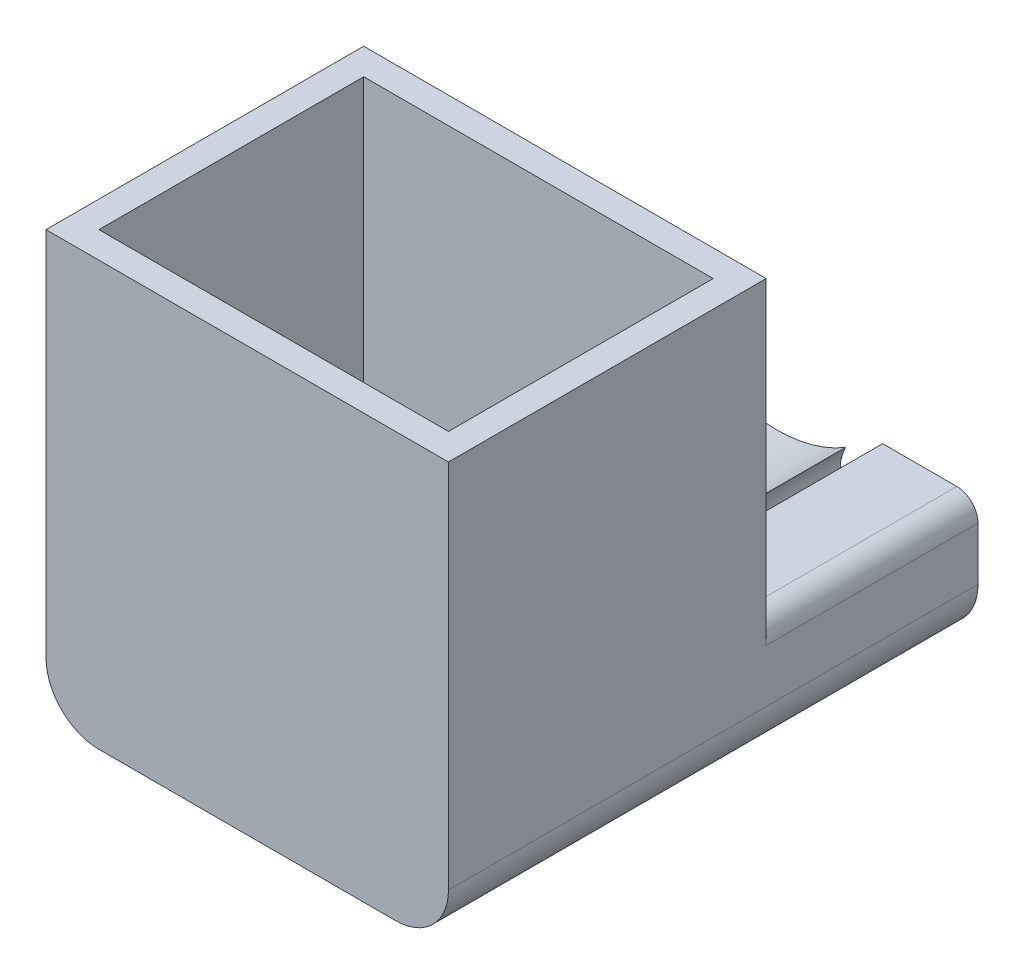
ISO-10303-21;
HEADER;
FILE_DESCRIPTION(('STEP AP214'),'2;1');
FILE_NAME('part.step','',(''),(''),'','','');
FILE_SCHEMA(('AUTOMOTIVE_DESIGN { 1 0 10303 214 1 1 1 1 }'));
ENDSEC;
DATA;
#1=APPLICATION_CONTEXT('core data for automotive mechanical design processes');
#2=APPLICATION_PROTOCOL_DEFINITION('international standard','automotive_design',2000,#1);
#3=PRODUCT_CONTEXT('',#1,'mechanical');
#4=PRODUCT('Part','Part','',(#3));
#5=PRODUCT_RELATED_PRODUCT_CATEGORY('part','',(#4));
#6=PRODUCT_DEFINITION_FORMATION('','',#4);
#7=PRODUCT_DEFINITION_CONTEXT('part definition',#1,'design');
#8=PRODUCT_DEFINITION('design','',#6,#7);
#9=PRODUCT_DEFINITION_SHAPE('','',#8);
#10=(LENGTH_UNIT() NAMED_UNIT(*) SI_UNIT(.MILLI.,.METRE.));
#11=(NAMED_UNIT(*) PLANE_ANGLE_UNIT() SI_UNIT($,.RADIAN.));
#12=(NAMED_UNIT(*) SI_UNIT($,.STERADIAN.) SOLID_ANGLE_UNIT());
#13=UNCERTAINTY_MEASURE_WITH_UNIT(LENGTH_MEASURE(1.E-05),#10,'distance_accuracy_value','');
#14=(GEOMETRIC_REPRESENTATION_CONTEXT(3) GLOBAL_UNCERTAINTY_ASSIGNED_CONTEXT((#13)) GLOBAL_UNIT_ASSIGNED_CONTEXT((#10,
#11,#12)) REPRESENTATION_CONTEXT('',''));
#15=CARTESIAN_POINT('',(0.,0.,0.));
#16=DIRECTION('',(0.,0.,1.));
#17=DIRECTION('',(1.,0.,0.));
#18=AXIS2_PLACEMENT_3D('',#15,#16,#17);
#19=CARTESIAN_POINT('',(-9.99999999999999,-13.1244047484067,10.));
#20=DIRECTION('',(0.,0.,-1.));
#21=DIRECTION('',(-1.,0.,0.));
#22=AXIS2_PLACEMENT_3D('',#19,#20,#21);
#23=CYLINDRICAL_SURFACE('',#22,4.);
#24=CARTESIAN_POINT('',(-9.99999999999999,-13.1244047484067,-10.));
#25=DIRECTION('',(0.,0.,-1.));
#26=DIRECTION('',(-1.,0.,0.));
#27=AXIS2_PLACEMENT_3D('',#24,#25,#26);
#28=CIRCLE('',#27,4.);
#29=CARTESIAN_POINT('',(-6.50911973324602,-11.1715209927295,-10.));
#30=VERTEX_POINT('',#29);
#31=CARTESIAN_POINT('',(-9.99999999999999,-9.12440474840669,-10.));
#32=VERTEX_POINT('',#31);
#33=EDGE_CURVE('E219',#30,#32,#28,.T.);
#34=ORIENTED_EDGE('',*,*,#33,.T.);
#35=DIRECTION('',(0.,0.,-1.));
#36=VECTOR('',#35,1.);
#37=CARTESIAN_POINT('',(-9.99999999999999,-9.12440474840669,10.));
#38=LINE('',#37,#36);
#39=CARTESIAN_POINT('',(-9.99999999999999,-9.12440474840669,10.));
#40=VERTEX_POINT('',#39);
#41=EDGE_CURVE('E262',#40,#32,#38,.T.);
#42=ORIENTED_EDGE('',*,*,#41,.F.);
#43=CARTESIAN_POINT('',(-9.99999999999999,-13.1244047484067,10.));
#44=DIRECTION('',(0.,0.,-1.));
#45=DIRECTION('',(-1.,0.,0.));
#46=AXIS2_PLACEMENT_3D('',#43,#44,#45);
#47=CIRCLE('',#46,4.);
#48=CARTESIAN_POINT('',(-6.50911973324602,-11.1715209927295,10.));
#49=VERTEX_POINT('',#48);
#50=EDGE_CURVE('E220',#49,#40,#47,.T.);
#51=ORIENTED_EDGE('',*,*,#50,.F.);
#52=DIRECTION('',(0.,0.,-1.));
#53=VECTOR('',#52,1.);
#54=CARTESIAN_POINT('',(-6.50911973324602,-11.1715209927295,10.));
#55=LINE('',#54,#53);
#56=EDGE_CURVE('E235',#49,#30,#55,.T.);
#57=ORIENTED_EDGE('',*,*,#56,.T.);
#58=EDGE_LOOP('',(#34,#42,#51,#57));
#59=FACE_BOUND('',#58,.T.);
#60=ADVANCED_FACE('F36',(#59),#23,.F.);
#61=CARTESIAN_POINT('',(-9.99999999999999,-9.12440474840669,10.));
#62=DIRECTION('',(0.,-1.,0.));
#63=DIRECTION('',(1.,0.,0.));
#64=AXIS2_PLACEMENT_3D('',#61,#62,#63);
#65=PLANE('',#64);
#66=DIRECTION('',(-1.,0.,0.));
#67=VECTOR('',#66,1.);
#68=CARTESIAN_POINT('',(-9.99999999999999,-9.12440474840669,-10.));
#69=LINE('',#68,#67);
#70=CARTESIAN_POINT('',(-17.,-9.12440474840669,-10.));
#71=VERTEX_POINT('',#70);
#72=EDGE_CURVE('E238',#32,#71,#69,.T.);
#73=ORIENTED_EDGE('',*,*,#72,.T.);
#74=DIRECTION('',(0.,0.,-1.));
#75=VECTOR('',#74,1.);
#76=CARTESIAN_POINT('',(-17.,-9.12440474840669,10.));
#77=LINE('',#76,#75);
#78=CARTESIAN_POINT('',(-17.,-9.12440474840669,10.));
#79=VERTEX_POINT('',#78);
#80=EDGE_CURVE('E291',#71,#79,#77,.F.);
#81=ORIENTED_EDGE('',*,*,#80,.T.);
#82=DIRECTION('',(-1.,0.,0.));
#83=VECTOR('',#82,1.);
#84=CARTESIAN_POINT('',(-9.99999999999999,-9.12440474840669,10.));
#85=LINE('',#84,#83);
#86=EDGE_CURVE('E223',#40,#79,#85,.T.);
#87=ORIENTED_EDGE('',*,*,#86,.F.);
#88=ORIENTED_EDGE('',*,*,#41,.T.);
#89=EDGE_LOOP('',(#73,#81,#87,#88));
#90=FACE_BOUND('',#89,.T.);
#91=ADVANCED_FACE('F352',(#90),#65,.F.);
#92=CARTESIAN_POINT('',(-19.,-9.12440474840669,10.));
#93=DIRECTION('',(1.,0.,0.));
#94=DIRECTION('',(0.,0.,-1.));
#95=AXIS2_PLACEMENT_3D('',#92,#93,#94);
#96=PLANE('',#95);
#97=DIRECTION('',(0.,-1.,0.));
#98=VECTOR('',#97,1.);
#99=CARTESIAN_POINT('',(-19.,-21.1244047484067,10.));
#100=LINE('',#99,#98);
#101=CARTESIAN_POINT('',(-19.,18.8755952515933,10.));
#102=VERTEX_POINT('',#101);
#103=CARTESIAN_POINT('',(-19.,-11.1244047484067,10.));
#104=VERTEX_POINT('',#103);
#105=EDGE_CURVE('E202',#102,#104,#100,.T.);
#106=ORIENTED_EDGE('',*,*,#105,.T.);
#107=DIRECTION('',(0.,0.,-1.));
#108=VECTOR('',#107,1.);
#109=CARTESIAN_POINT('',(-19.,-11.1244047484067,10.));
#110=LINE('',#109,#108);
#111=CARTESIAN_POINT('',(-19.,-11.1244047484067,-10.));
#112=VERTEX_POINT('',#111);
#113=EDGE_CURVE('E284',#104,#112,#110,.T.);
#114=ORIENTED_EDGE('',*,*,#113,.T.);
#115=DIRECTION('',(0.,-1.,0.));
#116=VECTOR('',#115,1.);
#117=CARTESIAN_POINT('',(-19.,-9.12440474840669,-10.));
#118=LINE('',#117,#116);
#119=CARTESIAN_POINT('',(-19.,-16.1244047484067,-10.));
#120=VERTEX_POINT('',#119);
#121=EDGE_CURVE('E241',#112,#120,#118,.T.);
#122=ORIENTED_EDGE('',*,*,#121,.T.);
#123=DIRECTION('',(0.,0.,-1.));
#124=VECTOR('',#123,1.);
#125=CARTESIAN_POINT('',(-19.,-16.1244047484067,10.));
#126=LINE('',#125,#124);
#127=CARTESIAN_POINT('',(-19.,-16.1244047484067,40.));
#128=VERTEX_POINT('',#127);
#129=EDGE_CURVE('E275',#120,#128,#126,.F.);
#130=ORIENTED_EDGE('',*,*,#129,.T.);
#131=DIRECTION('',(0.,-1.,0.));
#132=VECTOR('',#131,1.);
#133=CARTESIAN_POINT('',(-19.,-21.1244047484067,40.));
#134=LINE('',#133,#132);
#135=CARTESIAN_POINT('',(-19.,18.8755952515933,40.));
#136=VERTEX_POINT('',#135);
#137=EDGE_CURVE('E206',#136,#128,#134,.T.);
#138=ORIENTED_EDGE('',*,*,#137,.F.);
#139=DIRECTION('',(0.,0.,-1.));
#140=VECTOR('',#139,1.);
#141=CARTESIAN_POINT('',(-19.,18.8755952515933,40.));
#142=LINE('',#141,#140);
#143=EDGE_CURVE('E209',#136,#102,#142,.T.);
#144=ORIENTED_EDGE('',*,*,#143,.T.);
#145=EDGE_LOOP('',(#106,#114,#122,#130,#138,#144));
#146=FACE_BOUND('',#145,.T.);
#147=ADVANCED_FACE('F307',(#146),#96,.F.);
#148=CARTESIAN_POINT('',(-19.,-21.1244047484067,10.));
#149=DIRECTION('',(0.,1.,0.));
#150=DIRECTION('',(0.,0.,1.));
#151=AXIS2_PLACEMENT_3D('',#148,#149,#150);
#152=PLANE('',#151);
#153=DIRECTION('',(1.,0.,0.));
#154=VECTOR('',#153,1.);
#155=CARTESIAN_POINT('',(-19.,-21.1244047484067,40.));
#156=LINE('',#155,#154);
#157=CARTESIAN_POINT('',(-14.,-21.1244047484067,40.));
#158=VERTEX_POINT('',#157);
#159=CARTESIAN_POINT('',(14.,-21.1244047484067,40.));
#160=VERTEX_POINT('',#159);
#161=EDGE_CURVE('E198',#158,#160,#156,.T.);
#162=ORIENTED_EDGE('',*,*,#161,.F.);
#163=DIRECTION('',(0.,0.,-1.));
#164=VECTOR('',#163,1.);
#165=CARTESIAN_POINT('',(-14.,-21.1244047484067,10.));
#166=LINE('',#165,#164);
#167=CARTESIAN_POINT('',(-14.,-21.1244047484067,-10.));
#168=VERTEX_POINT('',#167);
#169=EDGE_CURVE('E267',#158,#168,#166,.T.);
#170=ORIENTED_EDGE('',*,*,#169,.T.);
#171=DIRECTION('',(1.,0.,0.));
#172=VECTOR('',#171,1.);
#173=CARTESIAN_POINT('',(-19.,-21.1244047484067,-10.));
#174=LINE('',#173,#172);
#175=CARTESIAN_POINT('',(14.,-21.1244047484067,-10.));
#176=VERTEX_POINT('',#175);
#177=EDGE_CURVE('E243',#168,#176,#174,.T.);
#178=ORIENTED_EDGE('',*,*,#177,.T.);
#179=DIRECTION('',(0.,0.,-1.));
#180=VECTOR('',#179,1.);
#181=CARTESIAN_POINT('',(14.,-21.1244047484067,10.));
#182=LINE('',#181,#180);
#183=EDGE_CURVE('E265',#176,#160,#182,.F.);
#184=ORIENTED_EDGE('',*,*,#183,.T.);
#185=EDGE_LOOP('',(#162,#170,#178,#184));
#186=FACE_BOUND('',#185,.T.);
#187=ADVANCED_FACE('F359',(#186),#152,.F.);
#188=CARTESIAN_POINT('',(19.,-21.1244047484067,10.));
#189=DIRECTION('',(-1.,0.,0.));
#190=DIRECTION('',(0.,0.,1.));
#191=AXIS2_PLACEMENT_3D('',#188,#189,#190);
#192=PLANE('',#191);
#193=DIRECTION('',(0.,1.,0.));
#194=VECTOR('',#193,1.);
#195=CARTESIAN_POINT('',(19.,-21.1244047484067,-10.));
#196=LINE('',#195,#194);
#197=CARTESIAN_POINT('',(19.,-16.1244047484067,-10.));
#198=VERTEX_POINT('',#197);
#199=CARTESIAN_POINT('',(19.,-11.1244047484067,-10.));
#200=VERTEX_POINT('',#199);
#201=EDGE_CURVE('E246',#198,#200,#196,.T.);
#202=ORIENTED_EDGE('',*,*,#201,.T.);
#203=DIRECTION('',(0.,0.,-1.));
#204=VECTOR('',#203,1.);
#205=CARTESIAN_POINT('',(19.,-11.1244047484067,10.));
#206=LINE('',#205,#204);
#207=CARTESIAN_POINT('',(19.,-11.1244047484067,10.));
#208=VERTEX_POINT('',#207);
#209=EDGE_CURVE('E296',#200,#208,#206,.F.);
#210=ORIENTED_EDGE('',*,*,#209,.T.);
#211=DIRECTION('',(0.,1.,0.));
#212=VECTOR('',#211,1.);
#213=CARTESIAN_POINT('',(19.,-21.1244047484067,10.));
#214=LINE('',#213,#212);
#215=CARTESIAN_POINT('',(19.,18.8755952515933,10.));
#216=VERTEX_POINT('',#215);
#217=EDGE_CURVE('E58',#208,#216,#214,.T.);
#218=ORIENTED_EDGE('',*,*,#217,.T.);
#219=DIRECTION('',(0.,0.,-1.));
#220=VECTOR('',#219,1.);
#221=CARTESIAN_POINT('',(19.,18.8755952515933,40.));
#222=LINE('',#221,#220);
#223=CARTESIAN_POINT('',(19.,18.8755952515933,40.));
#224=VERTEX_POINT('',#223);
#225=EDGE_CURVE('E216',#224,#216,#222,.T.);
#226=ORIENTED_EDGE('',*,*,#225,.F.);
#227=DIRECTION('',(0.,1.,0.));
#228=VECTOR('',#227,1.);
#229=CARTESIAN_POINT('',(19.,-21.1244047484067,40.));
#230=LINE('',#229,#228);
#231=CARTESIAN_POINT('',(19.,-16.1244047484067,40.));
#232=VERTEX_POINT('',#231);
#233=EDGE_CURVE('E201',#232,#224,#230,.T.);
#234=ORIENTED_EDGE('',*,*,#233,.F.);
#235=DIRECTION('',(0.,0.,-1.));
#236=VECTOR('',#235,1.);
#237=CARTESIAN_POINT('',(19.,-16.1244047484067,10.));
#238=LINE('',#237,#236);
#239=EDGE_CURVE('E281',#232,#198,#238,.T.);
#240=ORIENTED_EDGE('',*,*,#239,.T.);
#241=EDGE_LOOP('',(#202,#210,#218,#226,#234,#240));
#242=FACE_BOUND('',#241,.T.);
#243=ADVANCED_FACE('F327',(#242),#192,.F.);
#244=CARTESIAN_POINT('',(19.,-9.12440474840668,10.));
#245=DIRECTION('',(0.,-1.,0.));
#246=DIRECTION('',(0.,0.,-1.));
#247=AXIS2_PLACEMENT_3D('',#244,#245,#246);
#248=PLANE('',#247);
#249=DIRECTION('',(-1.,0.,0.));
#250=VECTOR('',#249,1.);
#251=CARTESIAN_POINT('',(19.,-9.12440474840668,10.));
#252=LINE('',#251,#250);
#253=CARTESIAN_POINT('',(17.,-9.12440474840668,10.));
#254=VERTEX_POINT('',#253);
#255=CARTESIAN_POINT('',(10.,-9.12440474840668,10.));
#256=VERTEX_POINT('',#255);
#257=EDGE_CURVE('E227',#254,#256,#252,.T.);
#258=ORIENTED_EDGE('',*,*,#257,.F.);
#259=DIRECTION('',(0.,0.,-1.));
#260=VECTOR('',#259,1.);
#261=CARTESIAN_POINT('',(17.,-9.12440474840668,10.));
#262=LINE('',#261,#260);
#263=CARTESIAN_POINT('',(17.,-9.12440474840668,-10.));
#264=VERTEX_POINT('',#263);
#265=EDGE_CURVE('E293',#254,#264,#262,.T.);
#266=ORIENTED_EDGE('',*,*,#265,.T.);
#267=DIRECTION('',(-1.,0.,0.));
#268=VECTOR('',#267,1.);
#269=CARTESIAN_POINT('',(19.,-9.12440474840668,-10.));
#270=LINE('',#269,#268);
#271=CARTESIAN_POINT('',(10.,-9.12440474840668,-10.));
#272=VERTEX_POINT('',#271);
#273=EDGE_CURVE('E249',#264,#272,#270,.T.);
#274=ORIENTED_EDGE('',*,*,#273,.T.);
#275=DIRECTION('',(0.,0.,-1.));
#276=VECTOR('',#275,1.);
#277=CARTESIAN_POINT('',(10.,-9.12440474840668,10.));
#278=LINE('',#277,#276);
#279=EDGE_CURVE('E259',#256,#272,#278,.T.);
#280=ORIENTED_EDGE('',*,*,#279,.F.);
#281=EDGE_LOOP('',(#258,#266,#274,#280));
#282=FACE_BOUND('',#281,.T.);
#283=ADVANCED_FACE('F337',(#282),#248,.F.);
#284=CARTESIAN_POINT('',(10.,-13.1244047484067,10.));
#285=DIRECTION('',(0.,0.,-1.));
#286=DIRECTION('',(-1.,0.,0.));
#287=AXIS2_PLACEMENT_3D('',#284,#285,#286);
#288=CYLINDRICAL_SURFACE('',#287,4.);
#289=CARTESIAN_POINT('',(10.,-13.1244047484067,-10.));
#290=DIRECTION('',(0.,0.,-1.));
#291=DIRECTION('',(1.,0.,0.));
#292=AXIS2_PLACEMENT_3D('',#289,#290,#291);
#293=CIRCLE('',#292,4.);
#294=CARTESIAN_POINT('',(6.50911973324603,-11.1715209927295,-10.));
#295=VERTEX_POINT('',#294);
#296=EDGE_CURVE('E251',#272,#295,#293,.T.);
#297=ORIENTED_EDGE('',*,*,#296,.T.);
#298=DIRECTION('',(0.,0.,-1.));
#299=VECTOR('',#298,1.);
#300=CARTESIAN_POINT('',(6.50911973324603,-11.1715209927295,10.));
#301=LINE('',#300,#299);
#302=CARTESIAN_POINT('',(6.50911973324603,-11.1715209927295,10.));
#303=VERTEX_POINT('',#302);
#304=EDGE_CURVE('E256',#303,#295,#301,.T.);
#305=ORIENTED_EDGE('',*,*,#304,.F.);
#306=CARTESIAN_POINT('',(10.,-13.1244047484067,10.));
#307=DIRECTION('',(0.,0.,-1.));
#308=DIRECTION('',(1.,0.,0.));
#309=AXIS2_PLACEMENT_3D('',#306,#307,#308);
#310=CIRCLE('',#309,4.);
#311=EDGE_CURVE('E229',#256,#303,#310,.T.);
#312=ORIENTED_EDGE('',*,*,#311,.F.);
#313=ORIENTED_EDGE('',*,*,#279,.T.);
#314=EDGE_LOOP('',(#297,#305,#312,#313));
#315=FACE_BOUND('',#314,.T.);
#316=ADVANCED_FACE('F342',(#315),#288,.F.);
#317=CARTESIAN_POINT('',(0.,-0.5,10.));
#318=DIRECTION('',(0.,0.,-1.));
#319=DIRECTION('',(-1.,0.,0.));
#320=AXIS2_PLACEMENT_3D('',#317,#318,#319);
#321=CYLINDRICAL_SURFACE('',#320,12.5);
#322=CARTESIAN_POINT('',(0.,-0.5,-10.));
#323=DIRECTION('',(0.,0.,-1.));
#324=DIRECTION('',(1.,0.,0.));
#325=AXIS2_PLACEMENT_3D('',#322,#323,#324);
#326=CIRCLE('',#325,12.5);
#327=EDGE_CURVE('E224',#295,#30,#326,.T.);
#328=ORIENTED_EDGE('',*,*,#327,.T.);
#329=ORIENTED_EDGE('',*,*,#56,.F.);
#330=CARTESIAN_POINT('',(0.,-0.5,10.));
#331=DIRECTION('',(0.,0.,-1.));
#332=DIRECTION('',(1.,0.,0.));
#333=AXIS2_PLACEMENT_3D('',#330,#331,#332);
#334=CIRCLE('',#333,12.5);
#335=EDGE_CURVE('E232',#303,#49,#334,.T.);
#336=ORIENTED_EDGE('',*,*,#335,.F.);
#337=ORIENTED_EDGE('',*,*,#304,.T.);
#338=EDGE_LOOP('',(#328,#329,#336,#337));
#339=FACE_BOUND('',#338,.T.);
#340=ADVANCED_FACE('F346',(#339),#321,.F.);
#341=CARTESIAN_POINT('',(-9.99999999999999,-13.1244047484067,-10.));
#342=DIRECTION('',(0.,0.,-1.));
#343=DIRECTION('',(-1.,0.,0.));
#344=AXIS2_PLACEMENT_3D('',#341,#342,#343);
#345=PLANE('',#344);
#346=ORIENTED_EDGE('',*,*,#121,.F.);
#347=CARTESIAN_POINT('',(-17.,-11.1244047484067,-10.));
#348=DIRECTION('',(0.,0.,-1.));
#349=DIRECTION('',(-1.,0.,0.));
#350=AXIS2_PLACEMENT_3D('',#347,#348,#349);
#351=CIRCLE('',#350,2.);
#352=EDGE_CURVE('E289',#112,#71,#351,.T.);
#353=ORIENTED_EDGE('',*,*,#352,.T.);
#354=ORIENTED_EDGE('',*,*,#72,.F.);
#355=ORIENTED_EDGE('',*,*,#33,.F.);
#356=ORIENTED_EDGE('',*,*,#327,.F.);
#357=ORIENTED_EDGE('',*,*,#296,.F.);
#358=ORIENTED_EDGE('',*,*,#273,.F.);
#359=CARTESIAN_POINT('',(17.,-11.1244047484067,-10.));
#360=DIRECTION('',(0.,0.,-1.));
#361=DIRECTION('',(-1.,0.,0.));
#362=AXIS2_PLACEMENT_3D('',#359,#360,#361);
#363=CIRCLE('',#362,2.);
#364=EDGE_CURVE('E287',#264,#200,#363,.T.);
#365=ORIENTED_EDGE('',*,*,#364,.T.);
#366=ORIENTED_EDGE('',*,*,#201,.F.);
#367=CARTESIAN_POINT('',(14.,-16.1244047484067,-10.));
#368=DIRECTION('',(0.,0.,-1.));
#369=DIRECTION('',(-1.,0.,0.));
#370=AXIS2_PLACEMENT_3D('',#367,#368,#369);
#371=CIRCLE('',#370,5.);
#372=EDGE_CURVE('E270',#198,#176,#371,.T.);
#373=ORIENTED_EDGE('',*,*,#372,.T.);
#374=ORIENTED_EDGE('',*,*,#177,.F.);
#375=CARTESIAN_POINT('',(-14.,-16.1244047484067,-10.));
#376=DIRECTION('',(0.,0.,-1.));
#377=DIRECTION('',(-1.,0.,0.));
#378=AXIS2_PLACEMENT_3D('',#375,#376,#377);
#379=CIRCLE('',#378,5.);
#380=EDGE_CURVE('E272',#168,#120,#379,.T.);
#381=ORIENTED_EDGE('',*,*,#380,.T.);
#382=EDGE_LOOP('',(#346,#353,#354,#355,#356,#357,#358,#365,#366,#373,#374,#381));
#383=FACE_BOUND('',#382,.T.);
#384=ADVANCED_FACE('F309',(#383),#345,.T.);
#385=CARTESIAN_POINT('',(0.,0.,10.));
#386=DIRECTION('',(0.,0.,1.));
#387=DIRECTION('',(1.,0.,0.));
#388=AXIS2_PLACEMENT_3D('',#385,#386,#387);
#389=PLANE('',#388);
#390=ORIENTED_EDGE('',*,*,#50,.T.);
#391=ORIENTED_EDGE('',*,*,#86,.T.);
#392=CARTESIAN_POINT('',(-17.,-11.1244047484067,10.));
#393=DIRECTION('',(0.,0.,1.));
#394=DIRECTION('',(1.,0.,0.));
#395=AXIS2_PLACEMENT_3D('',#392,#393,#394);
#396=CIRCLE('',#395,2.);
#397=EDGE_CURVE('E44',#79,#104,#396,.T.);
#398=ORIENTED_EDGE('',*,*,#397,.T.);
#399=ORIENTED_EDGE('',*,*,#105,.F.);
#400=DIRECTION('',(-1.,0.,0.));
#401=VECTOR('',#400,1.);
#402=CARTESIAN_POINT('',(19.,18.8755952515933,10.));
#403=LINE('',#402,#401);
#404=EDGE_CURVE('E211',#216,#102,#403,.T.);
#405=ORIENTED_EDGE('',*,*,#404,.F.);
#406=ORIENTED_EDGE('',*,*,#217,.F.);
#407=CARTESIAN_POINT('',(17.,-11.1244047484067,10.));
#408=DIRECTION('',(0.,0.,1.));
#409=DIRECTION('',(1.,0.,0.));
#410=AXIS2_PLACEMENT_3D('',#407,#408,#409);
#411=CIRCLE('',#410,2.);
#412=EDGE_CURVE('E11',#208,#254,#411,.T.);
#413=ORIENTED_EDGE('',*,*,#412,.T.);
#414=ORIENTED_EDGE('',*,*,#257,.T.);
#415=ORIENTED_EDGE('',*,*,#311,.T.);
#416=ORIENTED_EDGE('',*,*,#335,.T.);
#417=EDGE_LOOP('',(#390,#391,#398,#399,#405,#406,#413,#414,#415,#416));
#418=FACE_BOUND('',#417,.T.);
#419=ADVANCED_FACE('F301',(#418),#389,.F.);
#420=CARTESIAN_POINT('',(19.,18.8755952515933,40.));
#421=DIRECTION('',(0.,-1.,0.));
#422=DIRECTION('',(1.,0.,0.));
#423=AXIS2_PLACEMENT_3D('',#420,#421,#422);
#424=PLANE('',#423);
#425=DIRECTION('',(1.,0.,0.));
#426=VECTOR('',#425,1.);
#427=CARTESIAN_POINT('',(16.5,18.8755952515933,37.5));
#428=LINE('',#427,#426);
#429=CARTESIAN_POINT('',(-16.5,18.8755952515933,37.5));
#430=VERTEX_POINT('',#429);
#431=CARTESIAN_POINT('',(16.5,18.8755952515933,37.5));
#432=VERTEX_POINT('',#431);
#433=EDGE_CURVE('E189',#430,#432,#428,.T.);
#434=ORIENTED_EDGE('',*,*,#433,.F.);
#435=DIRECTION('',(0.,0.,1.));
#436=VECTOR('',#435,1.);
#437=CARTESIAN_POINT('',(-16.5,18.8755952515933,37.5));
#438=LINE('',#437,#436);
#439=CARTESIAN_POINT('',(-16.5,18.8755952515933,12.5));
#440=VERTEX_POINT('',#439);
#441=EDGE_CURVE('E51',#440,#430,#438,.T.);
#442=ORIENTED_EDGE('',*,*,#441,.F.);
#443=DIRECTION('',(-1.,0.,0.));
#444=VECTOR('',#443,1.);
#445=CARTESIAN_POINT('',(16.5,18.8755952515933,12.5));
#446=LINE('',#445,#444);
#447=CARTESIAN_POINT('',(16.5,18.8755952515933,12.5));
#448=VERTEX_POINT('',#447);
#449=EDGE_CURVE('E180',#448,#440,#446,.T.);
#450=ORIENTED_EDGE('',*,*,#449,.F.);
#451=DIRECTION('',(0.,0.,-1.));
#452=VECTOR('',#451,1.);
#453=CARTESIAN_POINT('',(16.5,18.8755952515933,37.5));
#454=LINE('',#453,#452);
#455=EDGE_CURVE('E183',#432,#448,#454,.T.);
#456=ORIENTED_EDGE('',*,*,#455,.F.);
#457=EDGE_LOOP('',(#434,#442,#450,#456));
#458=FACE_BOUND('',#457,.T.);
#459=ORIENTED_EDGE('',*,*,#404,.T.);
#460=ORIENTED_EDGE('',*,*,#143,.F.);
#461=DIRECTION('',(-1.,0.,0.));
#462=VECTOR('',#461,1.);
#463=CARTESIAN_POINT('',(19.,18.8755952515933,40.));
#464=LINE('',#463,#462);
#465=EDGE_CURVE('E204',#224,#136,#464,.T.);
#466=ORIENTED_EDGE('',*,*,#465,.F.);
#467=ORIENTED_EDGE('',*,*,#225,.T.);
#468=EDGE_LOOP('',(#459,#460,#466,#467));
#469=FACE_BOUND('',#468,.T.);
#470=ADVANCED_FACE('F325',(#458,#469),#424,.F.);
#471=CARTESIAN_POINT('',(0.,0.,40.));
#472=DIRECTION('',(0.,0.,1.));
#473=DIRECTION('',(1.,0.,0.));
#474=AXIS2_PLACEMENT_3D('',#471,#472,#473);
#475=PLANE('',#474);
#476=ORIENTED_EDGE('',*,*,#137,.T.);
#477=CARTESIAN_POINT('',(-14.,-16.1244047484067,40.));
#478=DIRECTION('',(0.,0.,1.));
#479=DIRECTION('',(1.,0.,0.));
#480=AXIS2_PLACEMENT_3D('',#477,#478,#479);
#481=CIRCLE('',#480,5.);
#482=EDGE_CURVE('E279',#128,#158,#481,.T.);
#483=ORIENTED_EDGE('',*,*,#482,.T.);
#484=ORIENTED_EDGE('',*,*,#161,.T.);
#485=CARTESIAN_POINT('',(14.,-16.1244047484067,40.));
#486=DIRECTION('',(0.,0.,1.));
#487=DIRECTION('',(1.,0.,0.));
#488=AXIS2_PLACEMENT_3D('',#485,#486,#487);
#489=CIRCLE('',#488,5.);
#490=EDGE_CURVE('E277',#160,#232,#489,.T.);
#491=ORIENTED_EDGE('',*,*,#490,.T.);
#492=ORIENTED_EDGE('',*,*,#233,.T.);
#493=ORIENTED_EDGE('',*,*,#465,.T.);
#494=EDGE_LOOP('',(#476,#483,#484,#491,#492,#493));
#495=FACE_BOUND('',#494,.T.);
#496=ADVANCED_FACE('F318',(#495),#475,.T.);
#497=CARTESIAN_POINT('',(-14.,-16.1244047484067,10.));
#498=DIRECTION('',(0.,0.,-1.));
#499=DIRECTION('',(-1.,0.,0.));
#500=AXIS2_PLACEMENT_3D('',#497,#498,#499);
#501=CYLINDRICAL_SURFACE('',#500,5.);
#502=ORIENTED_EDGE('',*,*,#482,.F.);
#503=ORIENTED_EDGE('',*,*,#129,.F.);
#504=ORIENTED_EDGE('',*,*,#380,.F.);
#505=ORIENTED_EDGE('',*,*,#169,.F.);
#506=EDGE_LOOP('',(#502,#503,#504,#505));
#507=FACE_BOUND('',#506,.T.);
#508=ADVANCED_FACE('F315',(#507),#501,.T.);
#509=CARTESIAN_POINT('',(14.,-16.1244047484067,10.));
#510=DIRECTION('',(0.,0.,-1.));
#511=DIRECTION('',(-1.,0.,0.));
#512=AXIS2_PLACEMENT_3D('',#509,#510,#511);
#513=CYLINDRICAL_SURFACE('',#512,5.);
#514=ORIENTED_EDGE('',*,*,#490,.F.);
#515=ORIENTED_EDGE('',*,*,#183,.F.);
#516=ORIENTED_EDGE('',*,*,#372,.F.);
#517=ORIENTED_EDGE('',*,*,#239,.F.);
#518=EDGE_LOOP('',(#514,#515,#516,#517));
#519=FACE_BOUND('',#518,.T.);
#520=ADVANCED_FACE('F366',(#519),#513,.T.);
#521=CARTESIAN_POINT('',(-17.,-11.1244047484067,10.));
#522=DIRECTION('',(0.,0.,-1.));
#523=DIRECTION('',(-1.,0.,0.));
#524=AXIS2_PLACEMENT_3D('',#521,#522,#523);
#525=CYLINDRICAL_SURFACE('',#524,2.);
#526=ORIENTED_EDGE('',*,*,#397,.F.);
#527=ORIENTED_EDGE('',*,*,#80,.F.);
#528=ORIENTED_EDGE('',*,*,#352,.F.);
#529=ORIENTED_EDGE('',*,*,#113,.F.);
#530=EDGE_LOOP('',(#526,#527,#528,#529));
#531=FACE_BOUND('',#530,.T.);
#532=ADVANCED_FACE('F304',(#531),#525,.T.);
#533=CARTESIAN_POINT('',(17.,-11.1244047484067,10.));
#534=DIRECTION('',(0.,0.,-1.));
#535=DIRECTION('',(-1.,0.,0.));
#536=AXIS2_PLACEMENT_3D('',#533,#534,#535);
#537=CYLINDRICAL_SURFACE('',#536,2.);
#538=ORIENTED_EDGE('',*,*,#412,.F.);
#539=ORIENTED_EDGE('',*,*,#209,.F.);
#540=ORIENTED_EDGE('',*,*,#364,.F.);
#541=ORIENTED_EDGE('',*,*,#265,.F.);
#542=EDGE_LOOP('',(#538,#539,#540,#541));
#543=FACE_BOUND('',#542,.T.);
#544=ADVANCED_FACE('F38',(#543),#537,.T.);
#545=CARTESIAN_POINT('',(-16.5,-16.1244047484067,37.5));
#546=DIRECTION('',(-1.,0.,0.));
#547=DIRECTION('',(0.,-1.,0.));
#548=AXIS2_PLACEMENT_3D('',#545,#546,#547);
#549=PLANE('',#548);
#550=ORIENTED_EDGE('',*,*,#441,.T.);
#551=DIRECTION('',(0.,1.,0.));
#552=VECTOR('',#551,1.);
#553=CARTESIAN_POINT('',(-16.5,-16.1244047484067,37.5));
#554=LINE('',#553,#552);
#555=CARTESIAN_POINT('',(-16.5,-16.1244047484067,37.5));
#556=VERTEX_POINT('',#555);
#557=EDGE_CURVE('E158',#556,#430,#554,.T.);
#558=ORIENTED_EDGE('',*,*,#557,.F.);
#559=DIRECTION('',(0.,0.,1.));
#560=VECTOR('',#559,1.);
#561=CARTESIAN_POINT('',(-16.5,-16.1244047484067,37.5));
#562=LINE('',#561,#560);
#563=CARTESIAN_POINT('',(-16.5,-16.1244047484067,12.5));
#564=VERTEX_POINT('',#563);
#565=EDGE_CURVE('E162',#564,#556,#562,.T.);
#566=ORIENTED_EDGE('',*,*,#565,.F.);
#567=DIRECTION('',(0.,1.,0.));
#568=VECTOR('',#567,1.);
#569=CARTESIAN_POINT('',(-16.5,-16.1244047484067,12.5));
#570=LINE('',#569,#568);
#571=EDGE_CURVE('E193',#564,#440,#570,.T.);
#572=ORIENTED_EDGE('',*,*,#571,.T.);
#573=EDGE_LOOP('',(#550,#558,#566,#572));
#574=FACE_BOUND('',#573,.T.);
#575=ADVANCED_FACE('F160',(#574),#549,.F.);
#576=CARTESIAN_POINT('',(16.5,-16.1244047484067,12.5));
#577=DIRECTION('',(0.,0.,-1.));
#578=DIRECTION('',(-1.,0.,0.));
#579=AXIS2_PLACEMENT_3D('',#576,#577,#578);
#580=PLANE('',#579);
#581=ORIENTED_EDGE('',*,*,#449,.T.);
#582=ORIENTED_EDGE('',*,*,#571,.F.);
#583=DIRECTION('',(-1.,0.,0.));
#584=VECTOR('',#583,1.);
#585=CARTESIAN_POINT('',(16.5,-16.1244047484067,12.5));
#586=LINE('',#585,#584);
#587=CARTESIAN_POINT('',(16.5,-16.1244047484067,12.5));
#588=VERTEX_POINT('',#587);
#589=EDGE_CURVE('E168',#588,#564,#586,.T.);
#590=ORIENTED_EDGE('',*,*,#589,.F.);
#591=DIRECTION('',(0.,1.,0.));
#592=VECTOR('',#591,1.);
#593=CARTESIAN_POINT('',(16.5,-16.1244047484067,12.5));
#594=LINE('',#593,#592);
#595=EDGE_CURVE('E195',#588,#448,#594,.T.);
#596=ORIENTED_EDGE('',*,*,#595,.T.);
#597=EDGE_LOOP('',(#581,#582,#590,#596));
#598=FACE_BOUND('',#597,.T.);
#599=ADVANCED_FACE('F376',(#598),#580,.F.);
#600=CARTESIAN_POINT('',(16.5,-16.1244047484067,37.5));
#601=DIRECTION('',(1.,0.,0.));
#602=DIRECTION('',(0.,1.,0.));
#603=AXIS2_PLACEMENT_3D('',#600,#601,#602);
#604=PLANE('',#603);
#605=ORIENTED_EDGE('',*,*,#455,.T.);
#606=ORIENTED_EDGE('',*,*,#595,.F.);
#607=DIRECTION('',(0.,0.,-1.));
#608=VECTOR('',#607,1.);
#609=CARTESIAN_POINT('',(16.5,-16.1244047484067,37.5));
#610=LINE('',#609,#608);
#611=CARTESIAN_POINT('',(16.5,-16.1244047484067,37.5));
#612=VERTEX_POINT('',#611);
#613=EDGE_CURVE('E176',#612,#588,#610,.T.);
#614=ORIENTED_EDGE('',*,*,#613,.F.);
#615=DIRECTION('',(0.,1.,0.));
#616=VECTOR('',#615,1.);
#617=CARTESIAN_POINT('',(16.5,-16.1244047484067,37.5));
#618=LINE('',#617,#616);
#619=EDGE_CURVE('E167',#612,#432,#618,.T.);
#620=ORIENTED_EDGE('',*,*,#619,.T.);
#621=EDGE_LOOP('',(#605,#606,#614,#620));
#622=FACE_BOUND('',#621,.T.);
#623=ADVANCED_FACE('F381',(#622),#604,.F.);
#624=CARTESIAN_POINT('',(16.5,-16.1244047484067,37.5));
#625=DIRECTION('',(0.,0.,1.));
#626=DIRECTION('',(1.,0.,0.));
#627=AXIS2_PLACEMENT_3D('',#624,#625,#626);
#628=PLANE('',#627);
#629=ORIENTED_EDGE('',*,*,#433,.T.);
#630=ORIENTED_EDGE('',*,*,#619,.F.);
#631=DIRECTION('',(1.,0.,0.));
#632=VECTOR('',#631,1.);
#633=CARTESIAN_POINT('',(16.5,-16.1244047484067,37.5));
#634=LINE('',#633,#632);
#635=EDGE_CURVE('E171',#556,#612,#634,.T.);
#636=ORIENTED_EDGE('',*,*,#635,.F.);
#637=ORIENTED_EDGE('',*,*,#557,.T.);
#638=EDGE_LOOP('',(#629,#630,#636,#637));
#639=FACE_BOUND('',#638,.T.);
#640=ADVANCED_FACE('F172',(#639),#628,.F.);
#641=CARTESIAN_POINT('',(0.,-16.1244047484067,0.));
#642=DIRECTION('',(0.,1.,0.));
#643=DIRECTION('',(0.,0.,1.));
#644=AXIS2_PLACEMENT_3D('',#641,#642,#643);
#645=PLANE('',#644);
#646=ORIENTED_EDGE('',*,*,#565,.T.);
#647=ORIENTED_EDGE('',*,*,#635,.T.);
#648=ORIENTED_EDGE('',*,*,#613,.T.);
#649=ORIENTED_EDGE('',*,*,#589,.T.);
#650=EDGE_LOOP('',(#646,#647,#648,#649));
#651=FACE_BOUND('',#650,.T.);
#652=ADVANCED_FACE('F178',(#651),#645,.T.);
#653=CLOSED_SHELL('',(#60,#91,#147,#187,#243,#283,#316,#340,#384,#419,#470,#496,#508,#520,#532,
#544,#575,#599,#623,#640,#652));
#654=MANIFOLD_SOLID_BREP('B2',#653);
#655=ADVANCED_BREP_SHAPE_REPRESENTATION('',(#18,#654),#14);
#656=SHAPE_DEFINITION_REPRESENTATION(#9,#655);
ENDSEC;
END-ISO-10303-21;
